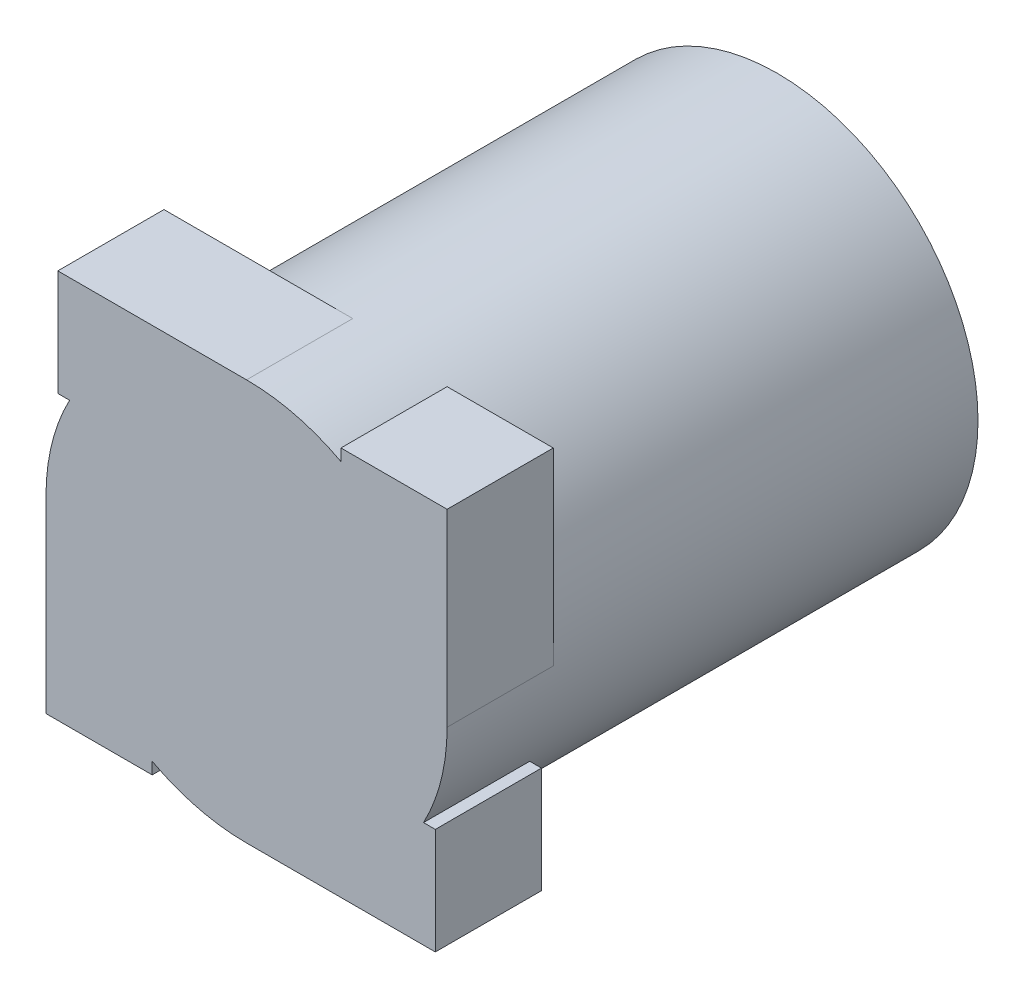
ISO-10303-21;
HEADER;
FILE_DESCRIPTION(('STEP AP214'),'2;1');
FILE_NAME('part.step','',(''),(''),'','','');
FILE_SCHEMA(('AUTOMOTIVE_DESIGN { 1 0 10303 214 1 1 1 1 }'));
ENDSEC;
DATA;
#1=APPLICATION_CONTEXT('core data for automotive mechanical design processes');
#2=APPLICATION_PROTOCOL_DEFINITION('international standard','automotive_design',2000,#1);
#3=PRODUCT_CONTEXT('',#1,'mechanical');
#4=PRODUCT('Part','Part','',(#3));
#5=PRODUCT_RELATED_PRODUCT_CATEGORY('part','',(#4));
#6=PRODUCT_DEFINITION_FORMATION('','',#4);
#7=PRODUCT_DEFINITION_CONTEXT('part definition',#1,'design');
#8=PRODUCT_DEFINITION('design','',#6,#7);
#9=PRODUCT_DEFINITION_SHAPE('','',#8);
#10=(LENGTH_UNIT() NAMED_UNIT(*) SI_UNIT(.MILLI.,.METRE.));
#11=(NAMED_UNIT(*) PLANE_ANGLE_UNIT() SI_UNIT($,.RADIAN.));
#12=(NAMED_UNIT(*) SI_UNIT($,.STERADIAN.) SOLID_ANGLE_UNIT());
#13=UNCERTAINTY_MEASURE_WITH_UNIT(LENGTH_MEASURE(1.E-05),#10,'distance_accuracy_value','');
#14=(GEOMETRIC_REPRESENTATION_CONTEXT(3) GLOBAL_UNCERTAINTY_ASSIGNED_CONTEXT((#13)) GLOBAL_UNIT_ASSIGNED_CONTEXT((#10,
#11,#12)) REPRESENTATION_CONTEXT('',''));
#15=CARTESIAN_POINT('',(0.,0.,0.));
#16=DIRECTION('',(0.,0.,1.));
#17=DIRECTION('',(1.,0.,0.));
#18=AXIS2_PLACEMENT_3D('',#15,#16,#17);
#19=CARTESIAN_POINT('',(0.,0.,49.5));
#20=DIRECTION('',(0.,0.,1.));
#21=DIRECTION('',(1.,0.,0.));
#22=AXIS2_PLACEMENT_3D('',#19,#20,#21);
#23=PLANE('',#22);
#24=CARTESIAN_POINT('',(0.,0.,49.5));
#25=DIRECTION('',(0.,0.,1.));
#26=DIRECTION('',(1.,0.,0.));
#27=AXIS2_PLACEMENT_3D('',#24,#25,#26);
#28=CIRCLE('',#27,17.);
#29=CARTESIAN_POINT('',(17.,0.,49.5));
#30=VERTEX_POINT('',#29);
#31=EDGE_CURVE('E249',#30,#30,#28,.T.);
#32=ORIENTED_EDGE('',*,*,#31,.F.);
#33=EDGE_LOOP('',(#32));
#34=FACE_BOUND('',#33,.T.);
#35=ADVANCED_FACE('F35',(#34),#23,.F.);
#36=CARTESIAN_POINT('',(0.,-16.,0.));
#37=DIRECTION('',(0.,1.,0.));
#38=DIRECTION('',(0.,0.,-1.));
#39=AXIS2_PLACEMENT_3D('',#36,#37,#38);
#40=PLANE('',#39);
#41=DIRECTION('',(0.,0.,1.));
#42=VECTOR('',#41,1.);
#43=CARTESIAN_POINT('',(-8.,-16.,94.5));
#44=LINE('',#43,#42);
#45=CARTESIAN_POINT('',(-8.,-16.,85.5));
#46=VERTEX_POINT('',#45);
#47=CARTESIAN_POINT('',(-8.,-16.,94.5));
#48=VERTEX_POINT('',#47);
#49=EDGE_CURVE('E178',#46,#48,#44,.T.);
#50=ORIENTED_EDGE('',*,*,#49,.T.);
#51=DIRECTION('',(-1.,0.,0.));
#52=VECTOR('',#51,1.);
#53=CARTESIAN_POINT('',(-8.,-16.,94.5));
#54=LINE('',#53,#52);
#55=CARTESIAN_POINT('',(-17.,-16.,94.5));
#56=VERTEX_POINT('',#55);
#57=EDGE_CURVE('E181',#48,#56,#54,.T.);
#58=ORIENTED_EDGE('',*,*,#57,.T.);
#59=DIRECTION('',(0.,0.,-1.));
#60=VECTOR('',#59,1.);
#61=CARTESIAN_POINT('',(-17.,-16.,94.5));
#62=LINE('',#61,#60);
#63=CARTESIAN_POINT('',(-17.,-16.,85.5));
#64=VERTEX_POINT('',#63);
#65=EDGE_CURVE('E183',#56,#64,#62,.T.);
#66=ORIENTED_EDGE('',*,*,#65,.T.);
#67=DIRECTION('',(1.,0.,0.));
#68=VECTOR('',#67,1.);
#69=CARTESIAN_POINT('',(-8.,-16.,85.5));
#70=LINE('',#69,#68);
#71=EDGE_CURVE('E185',#64,#46,#70,.T.);
#72=ORIENTED_EDGE('',*,*,#71,.T.);
#73=EDGE_LOOP('',(#50,#58,#66,#72));
#74=FACE_BOUND('',#73,.T.);
#75=ADVANCED_FACE('F315',(#74),#40,.F.);
#76=CARTESIAN_POINT('',(-16.,0.,0.));
#77=DIRECTION('',(1.,0.,0.));
#78=DIRECTION('',(0.,0.,-1.));
#79=AXIS2_PLACEMENT_3D('',#76,#77,#78);
#80=PLANE('',#79);
#81=DIRECTION('',(0.,0.,1.));
#82=VECTOR('',#81,1.);
#83=CARTESIAN_POINT('',(-16.,7.99999999999995,94.5));
#84=LINE('',#83,#82);
#85=CARTESIAN_POINT('',(-16.,7.99999999999995,85.5));
#86=VERTEX_POINT('',#85);
#87=CARTESIAN_POINT('',(-16.,7.99999999999995,94.5));
#88=VERTEX_POINT('',#87);
#89=EDGE_CURVE('E201',#86,#88,#84,.T.);
#90=ORIENTED_EDGE('',*,*,#89,.T.);
#91=DIRECTION('',(0.,1.,0.));
#92=VECTOR('',#91,1.);
#93=CARTESIAN_POINT('',(-16.,7.99999999999995,94.5));
#94=LINE('',#93,#92);
#95=CARTESIAN_POINT('',(-16.0000000000001,16.9999999999999,94.5));
#96=VERTEX_POINT('',#95);
#97=EDGE_CURVE('E204',#88,#96,#94,.T.);
#98=ORIENTED_EDGE('',*,*,#97,.T.);
#99=DIRECTION('',(0.,0.,-1.));
#100=VECTOR('',#99,1.);
#101=CARTESIAN_POINT('',(-16.0000000000001,16.9999999999999,94.5));
#102=LINE('',#101,#100);
#103=CARTESIAN_POINT('',(-16.0000000000001,16.9999999999999,85.5));
#104=VERTEX_POINT('',#103);
#105=EDGE_CURVE('E206',#96,#104,#102,.T.);
#106=ORIENTED_EDGE('',*,*,#105,.T.);
#107=DIRECTION('',(0.,-1.,0.));
#108=VECTOR('',#107,1.);
#109=CARTESIAN_POINT('',(-16.,7.99999999999995,85.5));
#110=LINE('',#109,#108);
#111=EDGE_CURVE('E208',#104,#86,#110,.T.);
#112=ORIENTED_EDGE('',*,*,#111,.T.);
#113=EDGE_LOOP('',(#90,#98,#106,#112));
#114=FACE_BOUND('',#113,.T.);
#115=ADVANCED_FACE('F309',(#114),#80,.F.);
#116=CARTESIAN_POINT('',(0.,16.,0.));
#117=DIRECTION('',(0.,-1.,0.));
#118=DIRECTION('',(0.,0.,-1.));
#119=AXIS2_PLACEMENT_3D('',#116,#117,#118);
#120=PLANE('',#119);
#121=DIRECTION('',(0.,0.,1.));
#122=VECTOR('',#121,1.);
#123=CARTESIAN_POINT('',(8.,16.,94.5));
#124=LINE('',#123,#122);
#125=CARTESIAN_POINT('',(8.,16.,85.5));
#126=VERTEX_POINT('',#125);
#127=CARTESIAN_POINT('',(8.,16.,94.5));
#128=VERTEX_POINT('',#127);
#129=EDGE_CURVE('E225',#126,#128,#124,.T.);
#130=ORIENTED_EDGE('',*,*,#129,.T.);
#131=DIRECTION('',(1.,0.,0.));
#132=VECTOR('',#131,1.);
#133=CARTESIAN_POINT('',(8.,16.,94.5));
#134=LINE('',#133,#132);
#135=CARTESIAN_POINT('',(17.,16.,94.5));
#136=VERTEX_POINT('',#135);
#137=EDGE_CURVE('E228',#128,#136,#134,.T.);
#138=ORIENTED_EDGE('',*,*,#137,.T.);
#139=DIRECTION('',(0.,0.,-1.));
#140=VECTOR('',#139,1.);
#141=CARTESIAN_POINT('',(17.,16.,94.5));
#142=LINE('',#141,#140);
#143=CARTESIAN_POINT('',(17.,16.,85.5));
#144=VERTEX_POINT('',#143);
#145=EDGE_CURVE('E230',#136,#144,#142,.T.);
#146=ORIENTED_EDGE('',*,*,#145,.T.);
#147=DIRECTION('',(-1.,0.,0.));
#148=VECTOR('',#147,1.);
#149=CARTESIAN_POINT('',(8.,16.,85.5));
#150=LINE('',#149,#148);
#151=EDGE_CURVE('E232',#144,#126,#150,.T.);
#152=ORIENTED_EDGE('',*,*,#151,.T.);
#153=EDGE_LOOP('',(#130,#138,#146,#152));
#154=FACE_BOUND('',#153,.T.);
#155=ADVANCED_FACE('F294',(#154),#120,.F.);
#156=CARTESIAN_POINT('',(16.,1.6759110426447E-13,0.));
#157=DIRECTION('',(-1.,0.,0.));
#158=DIRECTION('',(0.,0.,-1.));
#159=AXIS2_PLACEMENT_3D('',#156,#157,#158);
#160=PLANE('',#159);
#161=DIRECTION('',(0.,0.,1.));
#162=VECTOR('',#161,1.);
#163=CARTESIAN_POINT('',(16.0000000000001,-7.99999999999983,94.5));
#164=LINE('',#163,#162);
#165=CARTESIAN_POINT('',(16.0000000000001,-7.99999999999983,85.5));
#166=VERTEX_POINT('',#165);
#167=CARTESIAN_POINT('',(16.0000000000001,-7.99999999999983,94.5));
#168=VERTEX_POINT('',#167);
#169=EDGE_CURVE('E157',#166,#168,#164,.T.);
#170=ORIENTED_EDGE('',*,*,#169,.T.);
#171=DIRECTION('',(0.,-1.,0.));
#172=VECTOR('',#171,1.);
#173=CARTESIAN_POINT('',(16.0000000000001,-7.99999999999983,94.5));
#174=LINE('',#173,#172);
#175=CARTESIAN_POINT('',(16.0000000000002,-16.9999999999998,94.5));
#176=VERTEX_POINT('',#175);
#177=EDGE_CURVE('E148',#168,#176,#174,.T.);
#178=ORIENTED_EDGE('',*,*,#177,.T.);
#179=DIRECTION('',(0.,0.,-1.));
#180=VECTOR('',#179,1.);
#181=CARTESIAN_POINT('',(16.0000000000002,-16.9999999999998,94.5));
#182=LINE('',#181,#180);
#183=CARTESIAN_POINT('',(16.0000000000002,-16.9999999999998,85.5));
#184=VERTEX_POINT('',#183);
#185=EDGE_CURVE('E156',#176,#184,#182,.T.);
#186=ORIENTED_EDGE('',*,*,#185,.T.);
#187=DIRECTION('',(0.,1.,0.));
#188=VECTOR('',#187,1.);
#189=CARTESIAN_POINT('',(16.0000000000001,-7.99999999999983,85.5));
#190=LINE('',#189,#188);
#191=EDGE_CURVE('E162',#184,#166,#190,.T.);
#192=ORIENTED_EDGE('',*,*,#191,.T.);
#193=EDGE_LOOP('',(#170,#178,#186,#192));
#194=FACE_BOUND('',#193,.T.);
#195=ADVANCED_FACE('F160',(#194),#160,.F.);
#196=CARTESIAN_POINT('',(17.,16.,94.5));
#197=DIRECTION('',(-1.,0.,0.));
#198=DIRECTION('',(0.,0.,1.));
#199=AXIS2_PLACEMENT_3D('',#196,#197,#198);
#200=PLANE('',#199);
#201=DIRECTION('',(0.,0.,-1.));
#202=VECTOR('',#201,1.);
#203=CARTESIAN_POINT('',(17.,0.,94.5));
#204=LINE('',#203,#202);
#205=CARTESIAN_POINT('',(17.,0.,94.5));
#206=VERTEX_POINT('',#205);
#207=CARTESIAN_POINT('',(17.,0.,85.5));
#208=VERTEX_POINT('',#207);
#209=EDGE_CURVE('E224',#206,#208,#204,.T.);
#210=ORIENTED_EDGE('',*,*,#209,.T.);
#211=DIRECTION('',(0.,-1.,0.));
#212=VECTOR('',#211,1.);
#213=CARTESIAN_POINT('',(17.,16.,85.5));
#214=LINE('',#213,#212);
#215=EDGE_CURVE('E238',#144,#208,#214,.T.);
#216=ORIENTED_EDGE('',*,*,#215,.F.);
#217=ORIENTED_EDGE('',*,*,#145,.F.);
#218=DIRECTION('',(0.,-1.,0.));
#219=VECTOR('',#218,1.);
#220=CARTESIAN_POINT('',(17.,16.,94.5));
#221=LINE('',#220,#219);
#222=EDGE_CURVE('E241',#136,#206,#221,.T.);
#223=ORIENTED_EDGE('',*,*,#222,.T.);
#224=EDGE_LOOP('',(#210,#216,#217,#223));
#225=FACE_BOUND('',#224,.T.);
#226=ADVANCED_FACE('F280',(#225),#200,.F.);
#227=CARTESIAN_POINT('',(8.,16.,85.5));
#228=DIRECTION('',(0.,0.,1.));
#229=DIRECTION('',(1.,0.,0.));
#230=AXIS2_PLACEMENT_3D('',#227,#228,#229);
#231=PLANE('',#230);
#232=ORIENTED_EDGE('',*,*,#215,.T.);
#233=CARTESIAN_POINT('',(0.,0.,85.5));
#234=DIRECTION('',(0.,0.,1.));
#235=DIRECTION('',(1.,0.,0.));
#236=AXIS2_PLACEMENT_3D('',#233,#234,#235);
#237=CIRCLE('',#236,17.);
#238=CARTESIAN_POINT('',(8.,15.,85.5));
#239=VERTEX_POINT('',#238);
#240=EDGE_CURVE('E253',#208,#239,#237,.T.);
#241=ORIENTED_EDGE('',*,*,#240,.T.);
#242=DIRECTION('',(0.,-1.,0.));
#243=VECTOR('',#242,1.);
#244=CARTESIAN_POINT('',(8.,16.,85.5));
#245=LINE('',#244,#243);
#246=EDGE_CURVE('E234',#126,#239,#245,.T.);
#247=ORIENTED_EDGE('',*,*,#246,.F.);
#248=ORIENTED_EDGE('',*,*,#151,.F.);
#249=EDGE_LOOP('',(#232,#241,#247,#248));
#250=FACE_BOUND('',#249,.T.);
#251=ADVANCED_FACE('F287',(#250),#231,.F.);
#252=CARTESIAN_POINT('',(8.,16.,94.5));
#253=DIRECTION('',(1.,0.,0.));
#254=DIRECTION('',(0.,0.,-1.));
#255=AXIS2_PLACEMENT_3D('',#252,#253,#254);
#256=PLANE('',#255);
#257=ORIENTED_EDGE('',*,*,#246,.T.);
#258=DIRECTION('',(0.,0.,-1.));
#259=VECTOR('',#258,1.);
#260=CARTESIAN_POINT('',(8.,15.,94.5));
#261=LINE('',#260,#259);
#262=CARTESIAN_POINT('',(8.,15.,94.5));
#263=VERTEX_POINT('',#262);
#264=EDGE_CURVE('E247',#239,#263,#261,.F.);
#265=ORIENTED_EDGE('',*,*,#264,.T.);
#266=DIRECTION('',(0.,-1.,0.));
#267=VECTOR('',#266,1.);
#268=CARTESIAN_POINT('',(8.,16.,94.5));
#269=LINE('',#268,#267);
#270=EDGE_CURVE('E244',#128,#263,#269,.T.);
#271=ORIENTED_EDGE('',*,*,#270,.F.);
#272=ORIENTED_EDGE('',*,*,#129,.F.);
#273=EDGE_LOOP('',(#257,#265,#271,#272));
#274=FACE_BOUND('',#273,.T.);
#275=ADVANCED_FACE('F291',(#274),#256,.F.);
#276=CARTESIAN_POINT('',(-16.0000000000001,16.9999999999999,94.5));
#277=DIRECTION('',(0.,-1.,0.));
#278=DIRECTION('',(1.,0.,0.));
#279=AXIS2_PLACEMENT_3D('',#276,#277,#278);
#280=PLANE('',#279);
#281=DIRECTION('',(0.,0.,-1.));
#282=VECTOR('',#281,1.);
#283=CARTESIAN_POINT('',(0.,17.,94.5));
#284=LINE('',#283,#282);
#285=CARTESIAN_POINT('',(0.,17.,94.5));
#286=VERTEX_POINT('',#285);
#287=CARTESIAN_POINT('',(0.,17.,85.5));
#288=VERTEX_POINT('',#287);
#289=EDGE_CURVE('E200',#286,#288,#284,.T.);
#290=ORIENTED_EDGE('',*,*,#289,.T.);
#291=DIRECTION('',(1.,0.,0.));
#292=VECTOR('',#291,1.);
#293=CARTESIAN_POINT('',(-16.0000000000001,16.9999999999999,85.5));
#294=LINE('',#293,#292);
#295=EDGE_CURVE('E214',#104,#288,#294,.T.);
#296=ORIENTED_EDGE('',*,*,#295,.F.);
#297=ORIENTED_EDGE('',*,*,#105,.F.);
#298=DIRECTION('',(1.,0.,0.));
#299=VECTOR('',#298,1.);
#300=CARTESIAN_POINT('',(-16.0000000000001,16.9999999999999,94.5));
#301=LINE('',#300,#299);
#302=EDGE_CURVE('E217',#96,#286,#301,.T.);
#303=ORIENTED_EDGE('',*,*,#302,.T.);
#304=EDGE_LOOP('',(#290,#296,#297,#303));
#305=FACE_BOUND('',#304,.T.);
#306=ADVANCED_FACE('F301',(#305),#280,.F.);
#307=CARTESIAN_POINT('',(-16.,7.99999999999995,85.5));
#308=DIRECTION('',(0.,0.,1.));
#309=DIRECTION('',(1.,0.,0.));
#310=AXIS2_PLACEMENT_3D('',#307,#308,#309);
#311=PLANE('',#310);
#312=ORIENTED_EDGE('',*,*,#295,.T.);
#313=CARTESIAN_POINT('',(0.,0.,85.5));
#314=DIRECTION('',(0.,0.,1.));
#315=DIRECTION('',(1.,0.,0.));
#316=AXIS2_PLACEMENT_3D('',#313,#314,#315);
#317=CIRCLE('',#316,17.);
#318=CARTESIAN_POINT('',(-15.,7.99999999999995,85.5));
#319=VERTEX_POINT('',#318);
#320=EDGE_CURVE('E259',#288,#319,#317,.T.);
#321=ORIENTED_EDGE('',*,*,#320,.T.);
#322=DIRECTION('',(1.,0.,0.));
#323=VECTOR('',#322,1.);
#324=CARTESIAN_POINT('',(-16.,7.99999999999995,85.5));
#325=LINE('',#324,#323);
#326=EDGE_CURVE('E210',#86,#319,#325,.T.);
#327=ORIENTED_EDGE('',*,*,#326,.F.);
#328=ORIENTED_EDGE('',*,*,#111,.F.);
#329=EDGE_LOOP('',(#312,#321,#327,#328));
#330=FACE_BOUND('',#329,.T.);
#331=ADVANCED_FACE('F305',(#330),#311,.F.);
#332=CARTESIAN_POINT('',(-16.,7.99999999999995,94.5));
#333=DIRECTION('',(0.,1.,0.));
#334=DIRECTION('',(-1.,0.,0.));
#335=AXIS2_PLACEMENT_3D('',#332,#333,#334);
#336=PLANE('',#335);
#337=ORIENTED_EDGE('',*,*,#326,.T.);
#338=DIRECTION('',(0.,0.,-1.));
#339=VECTOR('',#338,1.);
#340=CARTESIAN_POINT('',(-15.,7.99999999999995,94.5));
#341=LINE('',#340,#339);
#342=CARTESIAN_POINT('',(-15.,7.99999999999995,94.5));
#343=VERTEX_POINT('',#342);
#344=EDGE_CURVE('E222',#319,#343,#341,.F.);
#345=ORIENTED_EDGE('',*,*,#344,.T.);
#346=DIRECTION('',(1.,0.,0.));
#347=VECTOR('',#346,1.);
#348=CARTESIAN_POINT('',(-16.,7.99999999999995,94.5));
#349=LINE('',#348,#347);
#350=EDGE_CURVE('E219',#88,#343,#349,.T.);
#351=ORIENTED_EDGE('',*,*,#350,.F.);
#352=ORIENTED_EDGE('',*,*,#89,.F.);
#353=EDGE_LOOP('',(#337,#345,#351,#352));
#354=FACE_BOUND('',#353,.T.);
#355=ADVANCED_FACE('F331',(#354),#336,.F.);
#356=CARTESIAN_POINT('',(-17.,-16.,94.5));
#357=DIRECTION('',(1.,0.,0.));
#358=DIRECTION('',(0.,0.,-1.));
#359=AXIS2_PLACEMENT_3D('',#356,#357,#358);
#360=PLANE('',#359);
#361=DIRECTION('',(0.,0.,-1.));
#362=VECTOR('',#361,1.);
#363=CARTESIAN_POINT('',(-17.,0.,94.5));
#364=LINE('',#363,#362);
#365=CARTESIAN_POINT('',(-17.,0.,94.5));
#366=VERTEX_POINT('',#365);
#367=CARTESIAN_POINT('',(-17.,0.,85.5));
#368=VERTEX_POINT('',#367);
#369=EDGE_CURVE('E172',#366,#368,#364,.T.);
#370=ORIENTED_EDGE('',*,*,#369,.T.);
#371=DIRECTION('',(0.,1.,0.));
#372=VECTOR('',#371,1.);
#373=CARTESIAN_POINT('',(-17.,-16.,85.5));
#374=LINE('',#373,#372);
#375=EDGE_CURVE('E191',#64,#368,#374,.T.);
#376=ORIENTED_EDGE('',*,*,#375,.F.);
#377=ORIENTED_EDGE('',*,*,#65,.F.);
#378=DIRECTION('',(0.,1.,0.));
#379=VECTOR('',#378,1.);
#380=CARTESIAN_POINT('',(-17.,-16.,94.5));
#381=LINE('',#380,#379);
#382=EDGE_CURVE('E58',#56,#366,#381,.T.);
#383=ORIENTED_EDGE('',*,*,#382,.T.);
#384=EDGE_LOOP('',(#370,#376,#377,#383));
#385=FACE_BOUND('',#384,.T.);
#386=ADVANCED_FACE('F313',(#385),#360,.F.);
#387=CARTESIAN_POINT('',(-8.,-16.,85.5));
#388=DIRECTION('',(0.,0.,1.));
#389=DIRECTION('',(1.,0.,0.));
#390=AXIS2_PLACEMENT_3D('',#387,#388,#389);
#391=PLANE('',#390);
#392=ORIENTED_EDGE('',*,*,#375,.T.);
#393=CARTESIAN_POINT('',(0.,0.,85.5));
#394=DIRECTION('',(0.,0.,1.));
#395=DIRECTION('',(1.,0.,0.));
#396=AXIS2_PLACEMENT_3D('',#393,#394,#395);
#397=CIRCLE('',#396,17.);
#398=CARTESIAN_POINT('',(-8.,-15.,85.5));
#399=VERTEX_POINT('',#398);
#400=EDGE_CURVE('E43',#368,#399,#397,.T.);
#401=ORIENTED_EDGE('',*,*,#400,.T.);
#402=DIRECTION('',(0.,1.,0.));
#403=VECTOR('',#402,1.);
#404=CARTESIAN_POINT('',(-8.,-16.,85.5));
#405=LINE('',#404,#403);
#406=EDGE_CURVE('E187',#46,#399,#405,.T.);
#407=ORIENTED_EDGE('',*,*,#406,.F.);
#408=ORIENTED_EDGE('',*,*,#71,.F.);
#409=EDGE_LOOP('',(#392,#401,#407,#408));
#410=FACE_BOUND('',#409,.T.);
#411=ADVANCED_FACE('F263',(#410),#391,.F.);
#412=CARTESIAN_POINT('',(-8.,-16.,94.5));
#413=DIRECTION('',(-1.,0.,0.));
#414=DIRECTION('',(0.,0.,1.));
#415=AXIS2_PLACEMENT_3D('',#412,#413,#414);
#416=PLANE('',#415);
#417=ORIENTED_EDGE('',*,*,#406,.T.);
#418=DIRECTION('',(0.,0.,-1.));
#419=VECTOR('',#418,1.);
#420=CARTESIAN_POINT('',(-8.,-15.,94.5));
#421=LINE('',#420,#419);
#422=CARTESIAN_POINT('',(-8.,-15.,94.5));
#423=VERTEX_POINT('',#422);
#424=EDGE_CURVE('E198',#399,#423,#421,.F.);
#425=ORIENTED_EDGE('',*,*,#424,.T.);
#426=DIRECTION('',(0.,1.,0.));
#427=VECTOR('',#426,1.);
#428=CARTESIAN_POINT('',(-8.,-16.,94.5));
#429=LINE('',#428,#427);
#430=EDGE_CURVE('E195',#48,#423,#429,.T.);
#431=ORIENTED_EDGE('',*,*,#430,.F.);
#432=ORIENTED_EDGE('',*,*,#49,.F.);
#433=EDGE_LOOP('',(#417,#425,#431,#432));
#434=FACE_BOUND('',#433,.T.);
#435=ADVANCED_FACE('F270',(#434),#416,.F.);
#436=CARTESIAN_POINT('',(0.,0.,94.5));
#437=DIRECTION('',(0.,0.,1.));
#438=DIRECTION('',(1.,0.,0.));
#439=AXIS2_PLACEMENT_3D('',#436,#437,#438);
#440=PLANE('',#439);
#441=CARTESIAN_POINT('',(0.,0.,94.5));
#442=DIRECTION('',(0.,0.,1.));
#443=DIRECTION('',(1.,0.,0.));
#444=AXIS2_PLACEMENT_3D('',#441,#442,#443);
#445=CIRCLE('',#444,17.);
#446=CARTESIAN_POINT('',(1.78065548281E-13,-17.,94.5));
#447=VERTEX_POINT('',#446);
#448=EDGE_CURVE('E273',#423,#447,#445,.T.);
#449=ORIENTED_EDGE('',*,*,#448,.T.);
#450=DIRECTION('',(-1.,0.,0.));
#451=VECTOR('',#450,1.);
#452=CARTESIAN_POINT('',(16.0000000000002,-16.9999999999998,94.5));
#453=LINE('',#452,#451);
#454=EDGE_CURVE('E50',#176,#447,#453,.T.);
#455=ORIENTED_EDGE('',*,*,#454,.F.);
#456=ORIENTED_EDGE('',*,*,#177,.F.);
#457=DIRECTION('',(-1.,0.,0.));
#458=VECTOR('',#457,1.);
#459=CARTESIAN_POINT('',(16.0000000000001,-7.99999999999983,94.5));
#460=LINE('',#459,#458);
#461=CARTESIAN_POINT('',(15.0000000000001,-7.99999999999984,94.5));
#462=VERTEX_POINT('',#461);
#463=EDGE_CURVE('E153',#168,#462,#460,.T.);
#464=ORIENTED_EDGE('',*,*,#463,.T.);
#465=EDGE_CURVE('E255',#462,#206,#445,.T.);
#466=ORIENTED_EDGE('',*,*,#465,.T.);
#467=ORIENTED_EDGE('',*,*,#222,.F.);
#468=ORIENTED_EDGE('',*,*,#137,.F.);
#469=ORIENTED_EDGE('',*,*,#270,.T.);
#470=EDGE_CURVE('E250',#263,#286,#445,.T.);
#471=ORIENTED_EDGE('',*,*,#470,.T.);
#472=ORIENTED_EDGE('',*,*,#302,.F.);
#473=ORIENTED_EDGE('',*,*,#97,.F.);
#474=ORIENTED_EDGE('',*,*,#350,.T.);
#475=EDGE_CURVE('E254',#343,#366,#445,.T.);
#476=ORIENTED_EDGE('',*,*,#475,.T.);
#477=ORIENTED_EDGE('',*,*,#382,.F.);
#478=ORIENTED_EDGE('',*,*,#57,.F.);
#479=ORIENTED_EDGE('',*,*,#430,.T.);
#480=EDGE_LOOP('',(#449,#455,#456,#464,#466,#467,#468,#469,#471,#472,#473,#474,#476,#477,#478,#479));
#481=FACE_BOUND('',#480,.T.);
#482=ADVANCED_FACE('F151',(#481),#440,.T.);
#483=CARTESIAN_POINT('',(16.0000000000002,-16.9999999999998,94.5));
#484=DIRECTION('',(0.,1.,0.));
#485=DIRECTION('',(-1.,0.,0.));
#486=AXIS2_PLACEMENT_3D('',#483,#484,#485);
#487=PLANE('',#486);
#488=DIRECTION('',(0.,0.,-1.));
#489=VECTOR('',#488,1.);
#490=CARTESIAN_POINT('',(1.78065548281E-13,-17.,94.5));
#491=LINE('',#490,#489);
#492=CARTESIAN_POINT('',(1.78065548281E-13,-17.,85.5));
#493=VERTEX_POINT('',#492);
#494=EDGE_CURVE('E166',#447,#493,#491,.T.);
#495=ORIENTED_EDGE('',*,*,#494,.T.);
#496=DIRECTION('',(-1.,0.,0.));
#497=VECTOR('',#496,1.);
#498=CARTESIAN_POINT('',(16.0000000000002,-16.9999999999998,85.5));
#499=LINE('',#498,#497);
#500=EDGE_CURVE('E174',#184,#493,#499,.T.);
#501=ORIENTED_EDGE('',*,*,#500,.F.);
#502=ORIENTED_EDGE('',*,*,#185,.F.);
#503=ORIENTED_EDGE('',*,*,#454,.T.);
#504=EDGE_LOOP('',(#495,#501,#502,#503));
#505=FACE_BOUND('',#504,.T.);
#506=ADVANCED_FACE('F349',(#505),#487,.F.);
#507=CARTESIAN_POINT('',(16.0000000000001,-7.99999999999983,85.5));
#508=DIRECTION('',(0.,0.,1.));
#509=DIRECTION('',(1.,0.,0.));
#510=AXIS2_PLACEMENT_3D('',#507,#508,#509);
#511=PLANE('',#510);
#512=ORIENTED_EDGE('',*,*,#500,.T.);
#513=CARTESIAN_POINT('',(0.,0.,85.5));
#514=DIRECTION('',(0.,0.,1.));
#515=DIRECTION('',(1.,0.,0.));
#516=AXIS2_PLACEMENT_3D('',#513,#514,#515);
#517=CIRCLE('',#516,17.);
#518=CARTESIAN_POINT('',(15.0000000000001,-7.99999999999984,85.5));
#519=VERTEX_POINT('',#518);
#520=EDGE_CURVE('E11',#493,#519,#517,.T.);
#521=ORIENTED_EDGE('',*,*,#520,.T.);
#522=DIRECTION('',(-1.,0.,0.));
#523=VECTOR('',#522,1.);
#524=CARTESIAN_POINT('',(16.0000000000001,-7.99999999999983,85.5));
#525=LINE('',#524,#523);
#526=EDGE_CURVE('E488',#166,#519,#525,.T.);
#527=ORIENTED_EDGE('',*,*,#526,.F.);
#528=ORIENTED_EDGE('',*,*,#191,.F.);
#529=EDGE_LOOP('',(#512,#521,#527,#528));
#530=FACE_BOUND('',#529,.T.);
#531=ADVANCED_FACE('F353',(#530),#511,.F.);
#532=CARTESIAN_POINT('',(16.0000000000001,-7.99999999999983,94.5));
#533=DIRECTION('',(0.,-1.,0.));
#534=DIRECTION('',(1.,0.,0.));
#535=AXIS2_PLACEMENT_3D('',#532,#533,#534);
#536=PLANE('',#535);
#537=ORIENTED_EDGE('',*,*,#526,.T.);
#538=DIRECTION('',(0.,0.,-1.));
#539=VECTOR('',#538,1.);
#540=CARTESIAN_POINT('',(15.0000000000001,-7.99999999999984,94.5));
#541=LINE('',#540,#539);
#542=EDGE_CURVE('E170',#519,#462,#541,.F.);
#543=ORIENTED_EDGE('',*,*,#542,.T.);
#544=ORIENTED_EDGE('',*,*,#463,.F.);
#545=ORIENTED_EDGE('',*,*,#169,.F.);
#546=EDGE_LOOP('',(#537,#543,#544,#545));
#547=FACE_BOUND('',#546,.T.);
#548=ADVANCED_FACE('F168',(#547),#536,.F.);
#549=CARTESIAN_POINT('',(0.,0.,94.5));
#550=DIRECTION('',(0.,0.,-1.));
#551=DIRECTION('',(-1.,0.,0.));
#552=AXIS2_PLACEMENT_3D('',#549,#550,#551);
#553=CYLINDRICAL_SURFACE('',#552,17.);
#554=ORIENTED_EDGE('',*,*,#31,.T.);
#555=EDGE_LOOP('',(#554));
#556=FACE_BOUND('',#555,.T.);
#557=ORIENTED_EDGE('',*,*,#542,.F.);
#558=ORIENTED_EDGE('',*,*,#520,.F.);
#559=ORIENTED_EDGE('',*,*,#494,.F.);
#560=ORIENTED_EDGE('',*,*,#448,.F.);
#561=ORIENTED_EDGE('',*,*,#424,.F.);
#562=ORIENTED_EDGE('',*,*,#400,.F.);
#563=ORIENTED_EDGE('',*,*,#369,.F.);
#564=ORIENTED_EDGE('',*,*,#475,.F.);
#565=ORIENTED_EDGE('',*,*,#344,.F.);
#566=ORIENTED_EDGE('',*,*,#320,.F.);
#567=ORIENTED_EDGE('',*,*,#289,.F.);
#568=ORIENTED_EDGE('',*,*,#470,.F.);
#569=ORIENTED_EDGE('',*,*,#264,.F.);
#570=ORIENTED_EDGE('',*,*,#240,.F.);
#571=ORIENTED_EDGE('',*,*,#209,.F.);
#572=ORIENTED_EDGE('',*,*,#465,.F.);
#573=EDGE_LOOP('',(#557,#558,#559,#560,#561,#562,#563,#564,#565,#566,#567,#568,#569,#570,#571,#572));
#574=FACE_BOUND('',#573,.T.);
#575=ADVANCED_FACE('F37',(#556,#574),#553,.T.);
#576=CLOSED_SHELL('',(#35,#75,#115,#155,#195,#226,#251,#275,#306,#331,#355,#386,#411,#435,#482,
#506,#531,#548,#575));
#577=MANIFOLD_SOLID_BREP('B2',#576);
#578=ADVANCED_BREP_SHAPE_REPRESENTATION('',(#18,#577),#14);
#579=SHAPE_DEFINITION_REPRESENTATION(#9,#578);
ENDSEC;
END-ISO-10303-21;
